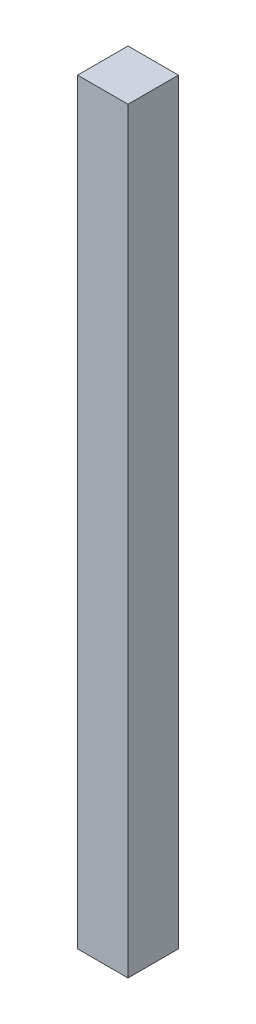
ISO-10303-21;
HEADER;
FILE_DESCRIPTION(('STEP AP214'),'2;1');
FILE_NAME('part.step','',(''),(''),'','','');
FILE_SCHEMA(('AUTOMOTIVE_DESIGN { 1 0 10303 214 1 1 1 1 }'));
ENDSEC;
DATA;
#1=APPLICATION_CONTEXT('core data for automotive mechanical design processes');
#2=APPLICATION_PROTOCOL_DEFINITION('international standard','automotive_design',2000,#1);
#3=PRODUCT_CONTEXT('',#1,'mechanical');
#4=PRODUCT('Part','Part','',(#3));
#5=PRODUCT_RELATED_PRODUCT_CATEGORY('part','',(#4));
#6=PRODUCT_DEFINITION_FORMATION('','',#4);
#7=PRODUCT_DEFINITION_CONTEXT('part definition',#1,'design');
#8=PRODUCT_DEFINITION('design','',#6,#7);
#9=PRODUCT_DEFINITION_SHAPE('','',#8);
#10=(LENGTH_UNIT() NAMED_UNIT(*) SI_UNIT(.MILLI.,.METRE.));
#11=(NAMED_UNIT(*) PLANE_ANGLE_UNIT() SI_UNIT($,.RADIAN.));
#12=(NAMED_UNIT(*) SI_UNIT($,.STERADIAN.) SOLID_ANGLE_UNIT());
#13=UNCERTAINTY_MEASURE_WITH_UNIT(LENGTH_MEASURE(1.E-05),#10,'distance_accuracy_value','');
#14=(GEOMETRIC_REPRESENTATION_CONTEXT(3) GLOBAL_UNCERTAINTY_ASSIGNED_CONTEXT((#13)) GLOBAL_UNIT_ASSIGNED_CONTEXT((#10,
#11,#12)) REPRESENTATION_CONTEXT('',''));
#15=CARTESIAN_POINT('',(0.,0.,0.));
#16=DIRECTION('',(0.,0.,1.));
#17=DIRECTION('',(1.,0.,0.));
#18=AXIS2_PLACEMENT_3D('',#15,#16,#17);
#19=CARTESIAN_POINT('',(-0.5,15.,0.5));
#20=DIRECTION('',(1.,0.,0.));
#21=DIRECTION('',(0.,0.,-1.));
#22=AXIS2_PLACEMENT_3D('',#19,#20,#21);
#23=PLANE('',#22);
#24=DIRECTION('',(0.,0.,1.));
#25=VECTOR('',#24,1.);
#26=CARTESIAN_POINT('',(-0.5,0.,0.5));
#27=LINE('',#26,#25);
#28=CARTESIAN_POINT('',(-0.5,0.,-0.5));
#29=VERTEX_POINT('',#28);
#30=CARTESIAN_POINT('',(-0.5,0.,0.5));
#31=VERTEX_POINT('',#30);
#32=EDGE_CURVE('E97',#29,#31,#27,.T.);
#33=ORIENTED_EDGE('',*,*,#32,.T.);
#34=DIRECTION('',(0.,-1.,0.));
#35=VECTOR('',#34,1.);
#36=CARTESIAN_POINT('',(-0.5,15.,0.5));
#37=LINE('',#36,#35);
#38=CARTESIAN_POINT('',(-0.5,15.,0.5));
#39=VERTEX_POINT('',#38);
#40=EDGE_CURVE('E11',#39,#31,#37,.T.);
#41=ORIENTED_EDGE('',*,*,#40,.F.);
#42=DIRECTION('',(0.,0.,1.));
#43=VECTOR('',#42,1.);
#44=CARTESIAN_POINT('',(-0.5,15.,0.5));
#45=LINE('',#44,#43);
#46=CARTESIAN_POINT('',(-0.5,15.,-0.5));
#47=VERTEX_POINT('',#46);
#48=EDGE_CURVE('E85',#47,#39,#45,.T.);
#49=ORIENTED_EDGE('',*,*,#48,.F.);
#50=DIRECTION('',(0.,-1.,0.));
#51=VECTOR('',#50,1.);
#52=CARTESIAN_POINT('',(-0.5,15.,-0.5));
#53=LINE('',#52,#51);
#54=EDGE_CURVE('E93',#47,#29,#53,.T.);
#55=ORIENTED_EDGE('',*,*,#54,.T.);
#56=EDGE_LOOP('',(#33,#41,#49,#55));
#57=FACE_BOUND('',#56,.T.);
#58=ADVANCED_FACE('F34',(#57),#23,.F.);
#59=CARTESIAN_POINT('',(0.5,15.,0.5));
#60=DIRECTION('',(0.,0.,-1.));
#61=DIRECTION('',(-1.,0.,0.));
#62=AXIS2_PLACEMENT_3D('',#59,#60,#61);
#63=PLANE('',#62);
#64=DIRECTION('',(1.,0.,0.));
#65=VECTOR('',#64,1.);
#66=CARTESIAN_POINT('',(0.5,0.,0.5));
#67=LINE('',#66,#65);
#68=CARTESIAN_POINT('',(0.5,0.,0.5));
#69=VERTEX_POINT('',#68);
#70=EDGE_CURVE('E89',#31,#69,#67,.T.);
#71=ORIENTED_EDGE('',*,*,#70,.T.);
#72=DIRECTION('',(0.,-1.,0.));
#73=VECTOR('',#72,1.);
#74=CARTESIAN_POINT('',(0.5,15.,0.5));
#75=LINE('',#74,#73);
#76=CARTESIAN_POINT('',(0.5,15.,0.5));
#77=VERTEX_POINT('',#76);
#78=EDGE_CURVE('E42',#77,#69,#75,.T.);
#79=ORIENTED_EDGE('',*,*,#78,.F.);
#80=DIRECTION('',(1.,0.,0.));
#81=VECTOR('',#80,1.);
#82=CARTESIAN_POINT('',(0.5,15.,0.5));
#83=LINE('',#82,#81);
#84=EDGE_CURVE('E80',#39,#77,#83,.T.);
#85=ORIENTED_EDGE('',*,*,#84,.F.);
#86=ORIENTED_EDGE('',*,*,#40,.T.);
#87=EDGE_LOOP('',(#71,#79,#85,#86));
#88=FACE_BOUND('',#87,.T.);
#89=ADVANCED_FACE('F88',(#88),#63,.F.);
#90=CARTESIAN_POINT('',(0.5,15.,0.5));
#91=DIRECTION('',(-1.,0.,0.));
#92=DIRECTION('',(0.,0.,1.));
#93=AXIS2_PLACEMENT_3D('',#90,#91,#92);
#94=PLANE('',#93);
#95=DIRECTION('',(0.,0.,-1.));
#96=VECTOR('',#95,1.);
#97=CARTESIAN_POINT('',(0.5,0.,0.5));
#98=LINE('',#97,#96);
#99=CARTESIAN_POINT('',(0.5,0.,-0.5));
#100=VERTEX_POINT('',#99);
#101=EDGE_CURVE('E67',#69,#100,#98,.T.);
#102=ORIENTED_EDGE('',*,*,#101,.T.);
#103=DIRECTION('',(0.,-1.,0.));
#104=VECTOR('',#103,1.);
#105=CARTESIAN_POINT('',(0.5,15.,-0.5));
#106=LINE('',#105,#104);
#107=CARTESIAN_POINT('',(0.5,15.,-0.5));
#108=VERTEX_POINT('',#107);
#109=EDGE_CURVE('E90',#108,#100,#106,.T.);
#110=ORIENTED_EDGE('',*,*,#109,.F.);
#111=DIRECTION('',(0.,0.,-1.));
#112=VECTOR('',#111,1.);
#113=CARTESIAN_POINT('',(0.5,15.,0.5));
#114=LINE('',#113,#112);
#115=EDGE_CURVE('E83',#77,#108,#114,.T.);
#116=ORIENTED_EDGE('',*,*,#115,.F.);
#117=ORIENTED_EDGE('',*,*,#78,.T.);
#118=EDGE_LOOP('',(#102,#110,#116,#117));
#119=FACE_BOUND('',#118,.T.);
#120=ADVANCED_FACE('F91',(#119),#94,.F.);
#121=CARTESIAN_POINT('',(0.5,15.,-0.5));
#122=DIRECTION('',(0.,0.,1.));
#123=DIRECTION('',(1.,0.,0.));
#124=AXIS2_PLACEMENT_3D('',#121,#122,#123);
#125=PLANE('',#124);
#126=DIRECTION('',(-1.,0.,0.));
#127=VECTOR('',#126,1.);
#128=CARTESIAN_POINT('',(0.5,0.,-0.5));
#129=LINE('',#128,#127);
#130=EDGE_CURVE('E73',#100,#29,#129,.T.);
#131=ORIENTED_EDGE('',*,*,#130,.T.);
#132=ORIENTED_EDGE('',*,*,#54,.F.);
#133=DIRECTION('',(-1.,0.,0.));
#134=VECTOR('',#133,1.);
#135=CARTESIAN_POINT('',(0.5,15.,-0.5));
#136=LINE('',#135,#134);
#137=EDGE_CURVE('E50',#108,#47,#136,.T.);
#138=ORIENTED_EDGE('',*,*,#137,.F.);
#139=ORIENTED_EDGE('',*,*,#109,.T.);
#140=EDGE_LOOP('',(#131,#132,#138,#139));
#141=FACE_BOUND('',#140,.T.);
#142=ADVANCED_FACE('F104',(#141),#125,.F.);
#143=CARTESIAN_POINT('',(0.,15.,0.));
#144=DIRECTION('',(0.,1.,0.));
#145=DIRECTION('',(0.,0.,1.));
#146=AXIS2_PLACEMENT_3D('',#143,#144,#145);
#147=PLANE('',#146);
#148=ORIENTED_EDGE('',*,*,#48,.T.);
#149=ORIENTED_EDGE('',*,*,#84,.T.);
#150=ORIENTED_EDGE('',*,*,#115,.T.);
#151=ORIENTED_EDGE('',*,*,#137,.T.);
#152=EDGE_LOOP('',(#148,#149,#150,#151));
#153=FACE_BOUND('',#152,.T.);
#154=ADVANCED_FACE('F81',(#153),#147,.T.);
#155=CARTESIAN_POINT('',(0.,0.,0.));
#156=DIRECTION('',(0.,1.,0.));
#157=DIRECTION('',(0.,0.,1.));
#158=AXIS2_PLACEMENT_3D('',#155,#156,#157);
#159=PLANE('',#158);
#160=ORIENTED_EDGE('',*,*,#32,.F.);
#161=ORIENTED_EDGE('',*,*,#130,.F.);
#162=ORIENTED_EDGE('',*,*,#101,.F.);
#163=ORIENTED_EDGE('',*,*,#70,.F.);
#164=EDGE_LOOP('',(#160,#161,#162,#163));
#165=FACE_BOUND('',#164,.T.);
#166=ADVANCED_FACE('F107',(#165),#159,.F.);
#167=CLOSED_SHELL('',(#58,#89,#120,#142,#154,#166));
#168=MANIFOLD_SOLID_BREP('B2',#167);
#169=ADVANCED_BREP_SHAPE_REPRESENTATION('',(#18,#168),#14);
#170=SHAPE_DEFINITION_REPRESENTATION(#9,#169);
ENDSEC;
END-ISO-10303-21;
